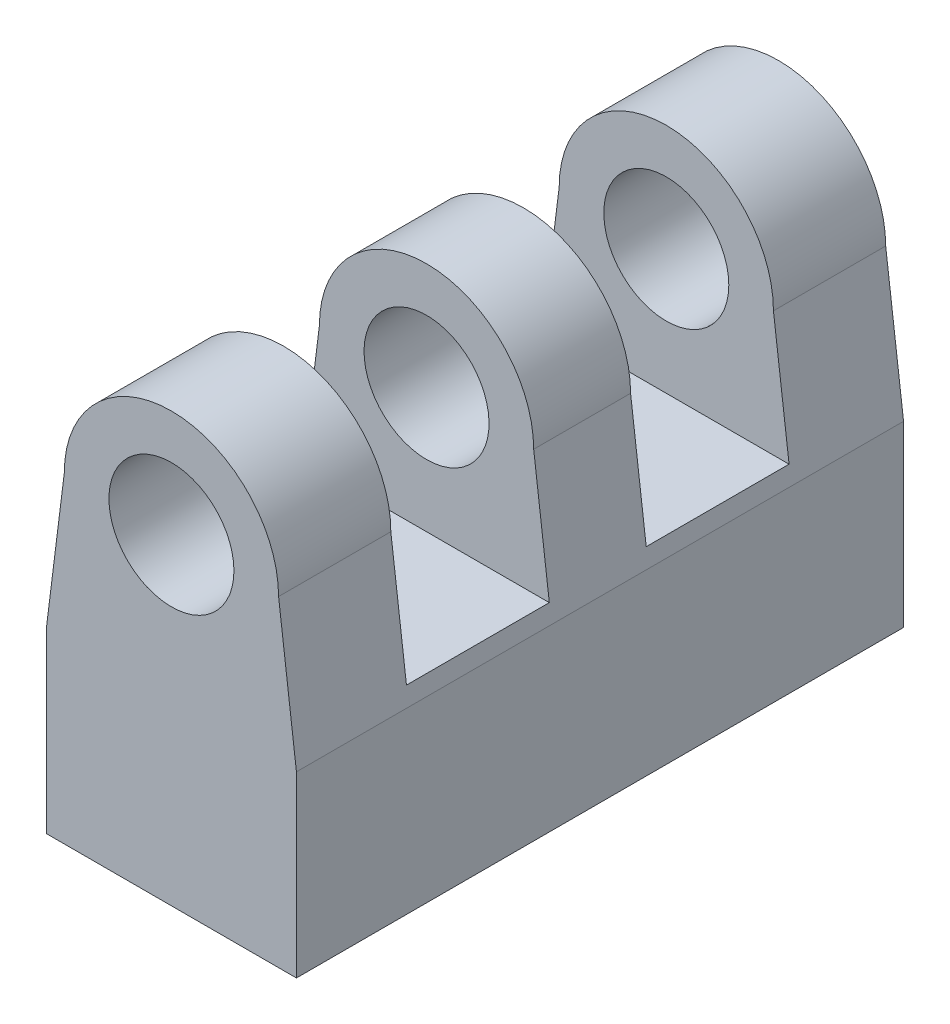
ISO-10303-21;
HEADER;
FILE_DESCRIPTION(('STEP AP214'),'2;1');
FILE_NAME('part.step','',(''),(''),'','','');
FILE_SCHEMA(('AUTOMOTIVE_DESIGN { 1 0 10303 214 1 1 1 1 }'));
ENDSEC;
DATA;
#1=APPLICATION_CONTEXT('core data for automotive mechanical design processes');
#2=APPLICATION_PROTOCOL_DEFINITION('international standard','automotive_design',2000,#1);
#3=PRODUCT_CONTEXT('',#1,'mechanical');
#4=PRODUCT('Part','Part','',(#3));
#5=PRODUCT_RELATED_PRODUCT_CATEGORY('part','',(#4));
#6=PRODUCT_DEFINITION_FORMATION('','',#4);
#7=PRODUCT_DEFINITION_CONTEXT('part definition',#1,'design');
#8=PRODUCT_DEFINITION('design','',#6,#7);
#9=PRODUCT_DEFINITION_SHAPE('','',#8);
#10=(LENGTH_UNIT() NAMED_UNIT(*) SI_UNIT(.MILLI.,.METRE.));
#11=(NAMED_UNIT(*) PLANE_ANGLE_UNIT() SI_UNIT($,.RADIAN.));
#12=(NAMED_UNIT(*) SI_UNIT($,.STERADIAN.) SOLID_ANGLE_UNIT());
#13=UNCERTAINTY_MEASURE_WITH_UNIT(LENGTH_MEASURE(1.E-05),#10,'distance_accuracy_value','');
#14=(GEOMETRIC_REPRESENTATION_CONTEXT(3) GLOBAL_UNCERTAINTY_ASSIGNED_CONTEXT((#13)) GLOBAL_UNIT_ASSIGNED_CONTEXT((#10,
#11,#12)) REPRESENTATION_CONTEXT('',''));
#15=CARTESIAN_POINT('',(0.,0.,0.));
#16=DIRECTION('',(0.,0.,1.));
#17=DIRECTION('',(1.,0.,0.));
#18=AXIS2_PLACEMENT_3D('',#15,#16,#17);
#19=CARTESIAN_POINT('',(6.,13.,34.));
#20=DIRECTION('',(-0.992277876713668,-0.124034734589208,0.));
#21=DIRECTION('',(0.124034734589208,-0.992277876713668,0.));
#22=AXIS2_PLACEMENT_3D('',#19,#20,#21);
#23=PLANE('',#22);
#24=DIRECTION('',(0.,0.,-1.));
#25=VECTOR('',#24,1.);
#26=CARTESIAN_POINT('',(6.875,6.,34.));
#27=LINE('',#26,#25);
#28=CARTESIAN_POINT('',(6.875,6.,27.7136266460323));
#29=VERTEX_POINT('',#28);
#30=CARTESIAN_POINT('',(6.875,6.,19.7136266460323));
#31=VERTEX_POINT('',#30);
#32=EDGE_CURVE('E165',#29,#31,#27,.T.);
#33=ORIENTED_EDGE('',*,*,#32,.F.);
#34=DIRECTION('',(-0.124034734589208,0.992277876713668,0.));
#35=VECTOR('',#34,1.);
#36=CARTESIAN_POINT('',(6.,13.,27.7136266460323));
#37=LINE('',#36,#35);
#38=CARTESIAN_POINT('',(6.,13.,27.7136266460323));
#39=VERTEX_POINT('',#38);
#40=EDGE_CURVE('E166',#29,#39,#37,.T.);
#41=ORIENTED_EDGE('',*,*,#40,.T.);
#42=DIRECTION('',(0.,0.,-1.));
#43=VECTOR('',#42,1.);
#44=CARTESIAN_POINT('',(6.,13.,34.));
#45=LINE('',#44,#43);
#46=CARTESIAN_POINT('',(6.,13.,34.));
#47=VERTEX_POINT('',#46);
#48=EDGE_CURVE('E235',#47,#39,#45,.T.);
#49=ORIENTED_EDGE('',*,*,#48,.F.);
#50=DIRECTION('',(-0.124034734589208,0.992277876713668,0.));
#51=VECTOR('',#50,1.);
#52=CARTESIAN_POINT('',(6.,13.,34.));
#53=LINE('',#52,#51);
#54=CARTESIAN_POINT('',(7.,5.,34.));
#55=VERTEX_POINT('',#54);
#56=EDGE_CURVE('E196',#55,#47,#53,.T.);
#57=ORIENTED_EDGE('',*,*,#56,.F.);
#58=DIRECTION('',(0.,0.,-1.));
#59=VECTOR('',#58,1.);
#60=CARTESIAN_POINT('',(7.,5.,34.));
#61=LINE('',#60,#59);
#62=CARTESIAN_POINT('',(7.,5.,0.));
#63=VERTEX_POINT('',#62);
#64=EDGE_CURVE('E239',#55,#63,#61,.T.);
#65=ORIENTED_EDGE('',*,*,#64,.T.);
#66=DIRECTION('',(-0.124034734589208,0.992277876713668,0.));
#67=VECTOR('',#66,1.);
#68=CARTESIAN_POINT('',(6.,13.,0.));
#69=LINE('',#68,#67);
#70=CARTESIAN_POINT('',(6.,13.,0.));
#71=VERTEX_POINT('',#70);
#72=EDGE_CURVE('E215',#63,#71,#69,.T.);
#73=ORIENTED_EDGE('',*,*,#72,.T.);
#74=CARTESIAN_POINT('',(6.,13.,6.28637335396769));
#75=VERTEX_POINT('',#74);
#76=EDGE_CURVE('E233',#75,#71,#45,.T.);
#77=ORIENTED_EDGE('',*,*,#76,.F.);
#78=DIRECTION('',(-0.124034734589208,0.992277876713668,0.));
#79=VECTOR('',#78,1.);
#80=CARTESIAN_POINT('',(6.,13.,6.28637335396769));
#81=LINE('',#80,#79);
#82=CARTESIAN_POINT('',(6.875,6.,6.28637335396769));
#83=VERTEX_POINT('',#82);
#84=EDGE_CURVE('E163',#83,#75,#81,.T.);
#85=ORIENTED_EDGE('',*,*,#84,.F.);
#86=DIRECTION('',(0.,0.,1.));
#87=VECTOR('',#86,1.);
#88=CARTESIAN_POINT('',(6.875,6.,34.));
#89=LINE('',#88,#87);
#90=CARTESIAN_POINT('',(6.875,6.,14.2863733539677));
#91=VERTEX_POINT('',#90);
#92=EDGE_CURVE('E152',#83,#91,#89,.T.);
#93=ORIENTED_EDGE('',*,*,#92,.T.);
#94=DIRECTION('',(-0.124034734589208,0.992277876713668,0.));
#95=VECTOR('',#94,1.);
#96=CARTESIAN_POINT('',(6.,13.,14.2863733539677));
#97=LINE('',#96,#95);
#98=CARTESIAN_POINT('',(6.,13.,14.2863733539677));
#99=VERTEX_POINT('',#98);
#100=EDGE_CURVE('E139',#91,#99,#97,.T.);
#101=ORIENTED_EDGE('',*,*,#100,.T.);
#102=CARTESIAN_POINT('',(6.,13.,19.7136266460323));
#103=VERTEX_POINT('',#102);
#104=EDGE_CURVE('E240',#103,#99,#45,.T.);
#105=ORIENTED_EDGE('',*,*,#104,.F.);
#106=DIRECTION('',(-0.124034734589208,0.992277876713668,0.));
#107=VECTOR('',#106,1.);
#108=CARTESIAN_POINT('',(6.,13.,19.7136266460323));
#109=LINE('',#108,#107);
#110=EDGE_CURVE('E271',#31,#103,#109,.T.);
#111=ORIENTED_EDGE('',*,*,#110,.F.);
#112=EDGE_LOOP('',(#33,#41,#49,#57,#65,#73,#77,#85,#93,#101,#105,#111));
#113=FACE_BOUND('',#112,.T.);
#114=ADVANCED_FACE('F39',(#113),#23,.F.);
#115=CARTESIAN_POINT('',(0.,13.,34.));
#116=DIRECTION('',(0.,0.,-1.));
#117=DIRECTION('',(-1.,0.,0.));
#118=AXIS2_PLACEMENT_3D('',#115,#116,#117);
#119=CYLINDRICAL_SURFACE('',#118,6.);
#120=DIRECTION('',(0.,0.,-1.));
#121=VECTOR('',#120,1.);
#122=CARTESIAN_POINT('',(-6.,13.,34.));
#123=LINE('',#122,#121);
#124=CARTESIAN_POINT('',(-6.,13.,19.7136266460323));
#125=VERTEX_POINT('',#124);
#126=CARTESIAN_POINT('',(-6.,13.,14.2863733539677));
#127=VERTEX_POINT('',#126);
#128=EDGE_CURVE('E234',#125,#127,#123,.T.);
#129=ORIENTED_EDGE('',*,*,#128,.F.);
#130=CARTESIAN_POINT('',(0.,13.,19.7136266460323));
#131=DIRECTION('',(0.,0.,1.));
#132=DIRECTION('',(0.,-1.,0.));
#133=AXIS2_PLACEMENT_3D('',#130,#131,#132);
#134=CIRCLE('',#133,6.);
#135=EDGE_CURVE('E63',#103,#125,#134,.T.);
#136=ORIENTED_EDGE('',*,*,#135,.F.);
#137=ORIENTED_EDGE('',*,*,#104,.T.);
#138=CARTESIAN_POINT('',(0.,13.,14.2863733539677));
#139=DIRECTION('',(0.,0.,1.));
#140=DIRECTION('',(0.,-1.,0.));
#141=AXIS2_PLACEMENT_3D('',#138,#139,#140);
#142=CIRCLE('',#141,6.);
#143=EDGE_CURVE('E141',#99,#127,#142,.T.);
#144=ORIENTED_EDGE('',*,*,#143,.T.);
#145=EDGE_LOOP('',(#129,#136,#137,#144));
#146=FACE_BOUND('',#145,.T.);
#147=ADVANCED_FACE('F346',(#146),#119,.T.);
#148=CARTESIAN_POINT('',(-6.,13.,6.28637335396769));
#149=VERTEX_POINT('',#148);
#150=CARTESIAN_POINT('',(-6.,13.,0.));
#151=VERTEX_POINT('',#150);
#152=EDGE_CURVE('E228',#149,#151,#123,.T.);
#153=ORIENTED_EDGE('',*,*,#152,.F.);
#154=CARTESIAN_POINT('',(0.,13.,6.28637335396769));
#155=DIRECTION('',(0.,0.,1.));
#156=DIRECTION('',(1.,0.,0.));
#157=AXIS2_PLACEMENT_3D('',#154,#155,#156);
#158=CIRCLE('',#157,6.);
#159=EDGE_CURVE('E287',#75,#149,#158,.T.);
#160=ORIENTED_EDGE('',*,*,#159,.F.);
#161=ORIENTED_EDGE('',*,*,#76,.T.);
#162=CARTESIAN_POINT('',(0.,13.,0.));
#163=DIRECTION('',(0.,0.,1.));
#164=DIRECTION('',(1.,0.,0.));
#165=AXIS2_PLACEMENT_3D('',#162,#163,#164);
#166=CIRCLE('',#165,6.);
#167=EDGE_CURVE('E219',#71,#151,#166,.T.);
#168=ORIENTED_EDGE('',*,*,#167,.T.);
#169=EDGE_LOOP('',(#153,#160,#161,#168));
#170=FACE_BOUND('',#169,.T.);
#171=ADVANCED_FACE('F340',(#170),#119,.T.);
#172=CARTESIAN_POINT('',(-6.,13.,34.));
#173=DIRECTION('',(0.992277876713668,-0.124034734589209,0.));
#174=DIRECTION('',(0.124034734589209,0.992277876713668,0.));
#175=AXIS2_PLACEMENT_3D('',#172,#173,#174);
#176=PLANE('',#175);
#177=CARTESIAN_POINT('',(-6.,13.,34.));
#178=VERTEX_POINT('',#177);
#179=CARTESIAN_POINT('',(-6.,13.,27.7136266460323));
#180=VERTEX_POINT('',#179);
#181=EDGE_CURVE('E229',#178,#180,#123,.T.);
#182=ORIENTED_EDGE('',*,*,#181,.T.);
#183=DIRECTION('',(-0.124034734589209,-0.992277876713668,0.));
#184=VECTOR('',#183,1.);
#185=CARTESIAN_POINT('',(-6.,13.,27.7136266460323));
#186=LINE('',#185,#184);
#187=CARTESIAN_POINT('',(-6.875,5.99999999999999,27.7136266460323));
#188=VERTEX_POINT('',#187);
#189=EDGE_CURVE('E270',#180,#188,#186,.T.);
#190=ORIENTED_EDGE('',*,*,#189,.T.);
#191=DIRECTION('',(0.,0.,1.));
#192=VECTOR('',#191,1.);
#193=CARTESIAN_POINT('',(-6.875,5.99999999999999,34.));
#194=LINE('',#193,#192);
#195=CARTESIAN_POINT('',(-6.875,5.99999999999999,19.7136266460323));
#196=VERTEX_POINT('',#195);
#197=EDGE_CURVE('E11',#196,#188,#194,.T.);
#198=ORIENTED_EDGE('',*,*,#197,.F.);
#199=DIRECTION('',(-0.124034734589209,-0.992277876713668,0.));
#200=VECTOR('',#199,1.);
#201=CARTESIAN_POINT('',(-6.,13.,19.7136266460323));
#202=LINE('',#201,#200);
#203=EDGE_CURVE('E266',#125,#196,#202,.T.);
#204=ORIENTED_EDGE('',*,*,#203,.F.);
#205=ORIENTED_EDGE('',*,*,#128,.T.);
#206=DIRECTION('',(-0.124034734589209,-0.992277876713668,0.));
#207=VECTOR('',#206,1.);
#208=CARTESIAN_POINT('',(-6.,13.,14.2863733539677));
#209=LINE('',#208,#207);
#210=CARTESIAN_POINT('',(-6.875,6.,14.2863733539677));
#211=VERTEX_POINT('',#210);
#212=EDGE_CURVE('E256',#127,#211,#209,.T.);
#213=ORIENTED_EDGE('',*,*,#212,.T.);
#214=DIRECTION('',(0.,0.,-1.));
#215=VECTOR('',#214,1.);
#216=CARTESIAN_POINT('',(-6.875,5.99999999999999,34.));
#217=LINE('',#216,#215);
#218=CARTESIAN_POINT('',(-6.875,5.99999999999999,6.28637335396769));
#219=VERTEX_POINT('',#218);
#220=EDGE_CURVE('E48',#211,#219,#217,.T.);
#221=ORIENTED_EDGE('',*,*,#220,.T.);
#222=DIRECTION('',(-0.124034734589209,-0.992277876713668,0.));
#223=VECTOR('',#222,1.);
#224=CARTESIAN_POINT('',(-6.,13.,6.28637335396769));
#225=LINE('',#224,#223);
#226=EDGE_CURVE('E261',#149,#219,#225,.T.);
#227=ORIENTED_EDGE('',*,*,#226,.F.);
#228=ORIENTED_EDGE('',*,*,#152,.T.);
#229=DIRECTION('',(-0.124034734589209,-0.992277876713668,0.));
#230=VECTOR('',#229,1.);
#231=CARTESIAN_POINT('',(-6.,13.,0.));
#232=LINE('',#231,#230);
#233=CARTESIAN_POINT('',(-7.,5.,0.));
#234=VERTEX_POINT('',#233);
#235=EDGE_CURVE('E190',#151,#234,#232,.T.);
#236=ORIENTED_EDGE('',*,*,#235,.T.);
#237=DIRECTION('',(0.,0.,-1.));
#238=VECTOR('',#237,1.);
#239=CARTESIAN_POINT('',(-7.,5.,34.));
#240=LINE('',#239,#238);
#241=CARTESIAN_POINT('',(-7.,5.,34.));
#242=VERTEX_POINT('',#241);
#243=EDGE_CURVE('E205',#242,#234,#240,.T.);
#244=ORIENTED_EDGE('',*,*,#243,.F.);
#245=DIRECTION('',(-0.124034734589209,-0.992277876713668,0.));
#246=VECTOR('',#245,1.);
#247=CARTESIAN_POINT('',(-6.,13.,34.));
#248=LINE('',#247,#246);
#249=EDGE_CURVE('E202',#178,#242,#248,.T.);
#250=ORIENTED_EDGE('',*,*,#249,.F.);
#251=EDGE_LOOP('',(#182,#190,#198,#204,#205,#213,#221,#227,#228,#236,#244,#250));
#252=FACE_BOUND('',#251,.T.);
#253=ADVANCED_FACE('F275',(#252),#176,.F.);
#254=CARTESIAN_POINT('',(0.,13.,34.));
#255=DIRECTION('',(0.,0.,-1.));
#256=DIRECTION('',(-1.,0.,0.));
#257=AXIS2_PLACEMENT_3D('',#254,#255,#256);
#258=CYLINDRICAL_SURFACE('',#257,3.5);
#259=CARTESIAN_POINT('',(0.,13.,0.));
#260=DIRECTION('',(0.,0.,1.));
#261=DIRECTION('',(1.,0.,0.));
#262=AXIS2_PLACEMENT_3D('',#259,#260,#261);
#263=CIRCLE('',#262,3.5);
#264=CARTESIAN_POINT('',(3.5,13.,0.));
#265=VERTEX_POINT('',#264);
#266=EDGE_CURVE('E170',#265,#265,#263,.T.);
#267=ORIENTED_EDGE('',*,*,#266,.F.);
#268=EDGE_LOOP('',(#267));
#269=FACE_BOUND('',#268,.T.);
#270=CARTESIAN_POINT('',(0.,13.,6.28637335396769));
#271=DIRECTION('',(0.,0.,1.));
#272=DIRECTION('',(1.,0.,0.));
#273=AXIS2_PLACEMENT_3D('',#270,#271,#272);
#274=CIRCLE('',#273,3.5);
#275=CARTESIAN_POINT('',(3.5,13.,6.28637335396769));
#276=VERTEX_POINT('',#275);
#277=EDGE_CURVE('E147',#276,#276,#274,.T.);
#278=ORIENTED_EDGE('',*,*,#277,.T.);
#279=EDGE_LOOP('',(#278));
#280=FACE_BOUND('',#279,.T.);
#281=ADVANCED_FACE('F379',(#269,#280),#258,.F.);
#282=CARTESIAN_POINT('',(0.,13.,34.));
#283=DIRECTION('',(0.,0.,1.));
#284=DIRECTION('',(1.,0.,0.));
#285=AXIS2_PLACEMENT_3D('',#282,#283,#284);
#286=PLANE('',#285);
#287=DIRECTION('',(0.,-1.,0.));
#288=VECTOR('',#287,1.);
#289=CARTESIAN_POINT('',(-7.,5.,34.));
#290=LINE('',#289,#288);
#291=CARTESIAN_POINT('',(-7.,-5.,34.));
#292=VERTEX_POINT('',#291);
#293=EDGE_CURVE('E185',#242,#292,#290,.T.);
#294=ORIENTED_EDGE('',*,*,#293,.T.);
#295=DIRECTION('',(1.,0.,0.));
#296=VECTOR('',#295,1.);
#297=CARTESIAN_POINT('',(7.,-5.,34.));
#298=LINE('',#297,#296);
#299=CARTESIAN_POINT('',(7.,-5.,34.));
#300=VERTEX_POINT('',#299);
#301=EDGE_CURVE('E189',#292,#300,#298,.T.);
#302=ORIENTED_EDGE('',*,*,#301,.T.);
#303=DIRECTION('',(0.,1.,0.));
#304=VECTOR('',#303,1.);
#305=CARTESIAN_POINT('',(7.,5.,34.));
#306=LINE('',#305,#304);
#307=EDGE_CURVE('E193',#300,#55,#306,.T.);
#308=ORIENTED_EDGE('',*,*,#307,.T.);
#309=ORIENTED_EDGE('',*,*,#56,.T.);
#310=CARTESIAN_POINT('',(0.,13.,34.));
#311=DIRECTION('',(0.,0.,1.));
#312=DIRECTION('',(1.,0.,0.));
#313=AXIS2_PLACEMENT_3D('',#310,#311,#312);
#314=CIRCLE('',#313,6.);
#315=EDGE_CURVE('E199',#47,#178,#314,.T.);
#316=ORIENTED_EDGE('',*,*,#315,.T.);
#317=ORIENTED_EDGE('',*,*,#249,.T.);
#318=EDGE_LOOP('',(#294,#302,#308,#309,#316,#317));
#319=FACE_BOUND('',#318,.T.);
#320=CARTESIAN_POINT('',(0.,13.,34.));
#321=DIRECTION('',(0.,0.,1.));
#322=DIRECTION('',(1.,0.,0.));
#323=AXIS2_PLACEMENT_3D('',#320,#321,#322);
#324=CIRCLE('',#323,3.5);
#325=CARTESIAN_POINT('',(3.5,13.,34.));
#326=VERTEX_POINT('',#325);
#327=EDGE_CURVE('E177',#326,#326,#324,.T.);
#328=ORIENTED_EDGE('',*,*,#327,.F.);
#329=EDGE_LOOP('',(#328));
#330=FACE_BOUND('',#329,.T.);
#331=ADVANCED_FACE('F316',(#319,#330),#286,.T.);
#332=CARTESIAN_POINT('',(0.,13.,0.));
#333=DIRECTION('',(0.,0.,1.));
#334=DIRECTION('',(1.,0.,0.));
#335=AXIS2_PLACEMENT_3D('',#332,#333,#334);
#336=PLANE('',#335);
#337=DIRECTION('',(0.,-1.,0.));
#338=VECTOR('',#337,1.);
#339=CARTESIAN_POINT('',(-7.,5.,0.));
#340=LINE('',#339,#338);
#341=CARTESIAN_POINT('',(-7.,-5.,0.));
#342=VERTEX_POINT('',#341);
#343=EDGE_CURVE('E181',#234,#342,#340,.T.);
#344=ORIENTED_EDGE('',*,*,#343,.F.);
#345=ORIENTED_EDGE('',*,*,#235,.F.);
#346=ORIENTED_EDGE('',*,*,#167,.F.);
#347=ORIENTED_EDGE('',*,*,#72,.F.);
#348=DIRECTION('',(0.,1.,0.));
#349=VECTOR('',#348,1.);
#350=CARTESIAN_POINT('',(7.,5.,0.));
#351=LINE('',#350,#349);
#352=CARTESIAN_POINT('',(7.,-5.,0.));
#353=VERTEX_POINT('',#352);
#354=EDGE_CURVE('E212',#353,#63,#351,.T.);
#355=ORIENTED_EDGE('',*,*,#354,.F.);
#356=DIRECTION('',(1.,0.,0.));
#357=VECTOR('',#356,1.);
#358=CARTESIAN_POINT('',(7.,-5.,0.));
#359=LINE('',#358,#357);
#360=EDGE_CURVE('E209',#342,#353,#359,.T.);
#361=ORIENTED_EDGE('',*,*,#360,.F.);
#362=EDGE_LOOP('',(#344,#345,#346,#347,#355,#361));
#363=FACE_BOUND('',#362,.T.);
#364=ORIENTED_EDGE('',*,*,#266,.T.);
#365=EDGE_LOOP('',(#364));
#366=FACE_BOUND('',#365,.T.);
#367=ADVANCED_FACE('F353',(#363,#366),#336,.F.);
#368=CARTESIAN_POINT('',(-7.,5.,34.));
#369=DIRECTION('',(1.,0.,0.));
#370=DIRECTION('',(0.,1.,0.));
#371=AXIS2_PLACEMENT_3D('',#368,#369,#370);
#372=PLANE('',#371);
#373=ORIENTED_EDGE('',*,*,#343,.T.);
#374=DIRECTION('',(0.,0.,-1.));
#375=VECTOR('',#374,1.);
#376=CARTESIAN_POINT('',(-7.,-5.,34.));
#377=LINE('',#376,#375);
#378=EDGE_CURVE('E248',#292,#342,#377,.T.);
#379=ORIENTED_EDGE('',*,*,#378,.F.);
#380=ORIENTED_EDGE('',*,*,#293,.F.);
#381=ORIENTED_EDGE('',*,*,#243,.T.);
#382=EDGE_LOOP('',(#373,#379,#380,#381));
#383=FACE_BOUND('',#382,.T.);
#384=ADVANCED_FACE('F41',(#383),#372,.F.);
#385=CARTESIAN_POINT('',(7.,-5.,34.));
#386=DIRECTION('',(0.,1.,0.));
#387=DIRECTION('',(-1.,0.,0.));
#388=AXIS2_PLACEMENT_3D('',#385,#386,#387);
#389=PLANE('',#388);
#390=CARTESIAN_POINT('',(-0.00187345435231069,-5.,27.));
#391=DIRECTION('',(0.,-1.,0.));
#392=DIRECTION('',(1.,0.,0.));
#393=AXIS2_PLACEMENT_3D('',#390,#391,#392);
#394=CIRCLE('',#393,5.05);
#395=CARTESIAN_POINT('',(5.04812654564769,-5.,27.));
#396=VERTEX_POINT('',#395);
#397=EDGE_CURVE('E424',#396,#396,#394,.T.);
#398=ORIENTED_EDGE('',*,*,#397,.F.);
#399=EDGE_LOOP('',(#398));
#400=FACE_BOUND('',#399,.T.);
#401=CARTESIAN_POINT('',(-0.00187345435231069,-5.,7.));
#402=DIRECTION('',(0.,-1.,0.));
#403=DIRECTION('',(1.,0.,0.));
#404=AXIS2_PLACEMENT_3D('',#401,#402,#403);
#405=CIRCLE('',#404,5.05);
#406=CARTESIAN_POINT('',(5.04812654564769,-5.,7.));
#407=VERTEX_POINT('',#406);
#408=EDGE_CURVE('E428',#407,#407,#405,.T.);
#409=ORIENTED_EDGE('',*,*,#408,.F.);
#410=EDGE_LOOP('',(#409));
#411=FACE_BOUND('',#410,.T.);
#412=ORIENTED_EDGE('',*,*,#360,.T.);
#413=DIRECTION('',(0.,0.,-1.));
#414=VECTOR('',#413,1.);
#415=CARTESIAN_POINT('',(7.,-5.,34.));
#416=LINE('',#415,#414);
#417=EDGE_CURVE('E244',#300,#353,#416,.T.);
#418=ORIENTED_EDGE('',*,*,#417,.F.);
#419=ORIENTED_EDGE('',*,*,#301,.F.);
#420=ORIENTED_EDGE('',*,*,#378,.T.);
#421=EDGE_LOOP('',(#412,#418,#419,#420));
#422=FACE_BOUND('',#421,.T.);
#423=ADVANCED_FACE('F358',(#400,#411,#422),#389,.F.);
#424=CARTESIAN_POINT('',(7.,5.,34.));
#425=DIRECTION('',(-1.,0.,0.));
#426=DIRECTION('',(0.,-1.,0.));
#427=AXIS2_PLACEMENT_3D('',#424,#425,#426);
#428=PLANE('',#427);
#429=ORIENTED_EDGE('',*,*,#354,.T.);
#430=ORIENTED_EDGE('',*,*,#64,.F.);
#431=ORIENTED_EDGE('',*,*,#307,.F.);
#432=ORIENTED_EDGE('',*,*,#417,.T.);
#433=EDGE_LOOP('',(#429,#430,#431,#432));
#434=FACE_BOUND('',#433,.T.);
#435=ADVANCED_FACE('F361',(#434),#428,.F.);
#436=CARTESIAN_POINT('',(0.,13.,27.7136266460323));
#437=DIRECTION('',(0.,0.,1.));
#438=DIRECTION('',(1.,0.,0.));
#439=AXIS2_PLACEMENT_3D('',#436,#437,#438);
#440=CIRCLE('',#439,6.);
#441=EDGE_CURVE('E173',#39,#180,#440,.T.);
#442=ORIENTED_EDGE('',*,*,#441,.T.);
#443=ORIENTED_EDGE('',*,*,#181,.F.);
#444=ORIENTED_EDGE('',*,*,#315,.F.);
#445=ORIENTED_EDGE('',*,*,#48,.T.);
#446=EDGE_LOOP('',(#442,#443,#444,#445));
#447=FACE_BOUND('',#446,.T.);
#448=ADVANCED_FACE('F304',(#447),#119,.T.);
#449=CARTESIAN_POINT('',(0.,13.,27.7136266460323));
#450=DIRECTION('',(0.,0.,1.));
#451=DIRECTION('',(1.,0.,0.));
#452=AXIS2_PLACEMENT_3D('',#449,#450,#451);
#453=CIRCLE('',#452,3.5);
#454=CARTESIAN_POINT('',(3.5,13.,27.7136266460323));
#455=VERTEX_POINT('',#454);
#456=EDGE_CURVE('E267',#455,#455,#453,.T.);
#457=ORIENTED_EDGE('',*,*,#456,.F.);
#458=EDGE_LOOP('',(#457));
#459=FACE_BOUND('',#458,.T.);
#460=ORIENTED_EDGE('',*,*,#327,.T.);
#461=EDGE_LOOP('',(#460));
#462=FACE_BOUND('',#461,.T.);
#463=ADVANCED_FACE('F368',(#459,#462),#258,.F.);
#464=CARTESIAN_POINT('',(-7.,5.99999999999999,0.));
#465=DIRECTION('',(0.,-1.,0.));
#466=DIRECTION('',(1.,0.,0.));
#467=AXIS2_PLACEMENT_3D('',#464,#465,#466);
#468=PLANE('',#467);
#469=DIRECTION('',(1.,0.,0.));
#470=VECTOR('',#469,1.);
#471=CARTESIAN_POINT('',(-7.,5.99999999999999,6.28637335396769));
#472=LINE('',#471,#470);
#473=EDGE_CURVE('E157',#219,#83,#472,.T.);
#474=ORIENTED_EDGE('',*,*,#473,.F.);
#475=ORIENTED_EDGE('',*,*,#220,.F.);
#476=DIRECTION('',(1.,0.,0.));
#477=VECTOR('',#476,1.);
#478=CARTESIAN_POINT('',(-7.,5.99999999999999,14.2863733539677));
#479=LINE('',#478,#477);
#480=EDGE_CURVE('E55',#211,#91,#479,.T.);
#481=ORIENTED_EDGE('',*,*,#480,.T.);
#482=ORIENTED_EDGE('',*,*,#92,.F.);
#483=EDGE_LOOP('',(#474,#475,#481,#482));
#484=FACE_BOUND('',#483,.T.);
#485=ADVANCED_FACE('F151',(#484),#468,.F.);
#486=CARTESIAN_POINT('',(-7.,0.,6.28637335396769));
#487=DIRECTION('',(0.,0.,1.));
#488=DIRECTION('',(1.,0.,0.));
#489=AXIS2_PLACEMENT_3D('',#486,#487,#488);
#490=PLANE('',#489);
#491=ORIENTED_EDGE('',*,*,#277,.F.);
#492=EDGE_LOOP('',(#491));
#493=FACE_BOUND('',#492,.T.);
#494=ORIENTED_EDGE('',*,*,#84,.T.);
#495=ORIENTED_EDGE('',*,*,#159,.T.);
#496=ORIENTED_EDGE('',*,*,#226,.T.);
#497=ORIENTED_EDGE('',*,*,#473,.T.);
#498=EDGE_LOOP('',(#494,#495,#496,#497));
#499=FACE_BOUND('',#498,.T.);
#500=ADVANCED_FACE('F337',(#493,#499),#490,.T.);
#501=CARTESIAN_POINT('',(-7.,0.,14.2863733539677));
#502=DIRECTION('',(0.,0.,1.));
#503=DIRECTION('',(0.,-1.,0.));
#504=AXIS2_PLACEMENT_3D('',#501,#502,#503);
#505=PLANE('',#504);
#506=CARTESIAN_POINT('',(0.,13.,14.2863733539677));
#507=DIRECTION('',(0.,0.,1.));
#508=DIRECTION('',(0.,-1.,0.));
#509=AXIS2_PLACEMENT_3D('',#506,#507,#508);
#510=CIRCLE('',#509,3.5);
#511=CARTESIAN_POINT('',(0.,9.5,14.2863733539677));
#512=VERTEX_POINT('',#511);
#513=EDGE_CURVE('E252',#512,#512,#510,.T.);
#514=ORIENTED_EDGE('',*,*,#513,.T.);
#515=EDGE_LOOP('',(#514));
#516=FACE_BOUND('',#515,.T.);
#517=ORIENTED_EDGE('',*,*,#480,.F.);
#518=ORIENTED_EDGE('',*,*,#212,.F.);
#519=ORIENTED_EDGE('',*,*,#143,.F.);
#520=ORIENTED_EDGE('',*,*,#100,.F.);
#521=EDGE_LOOP('',(#517,#518,#519,#520));
#522=FACE_BOUND('',#521,.T.);
#523=ADVANCED_FACE('F140',(#516,#522),#505,.F.);
#524=CARTESIAN_POINT('',(-7.,5.99999999999999,0.));
#525=DIRECTION('',(0.,1.,0.));
#526=DIRECTION('',(-1.,0.,0.));
#527=AXIS2_PLACEMENT_3D('',#524,#525,#526);
#528=PLANE('',#527);
#529=ORIENTED_EDGE('',*,*,#32,.T.);
#530=DIRECTION('',(1.,0.,0.));
#531=VECTOR('',#530,1.);
#532=CARTESIAN_POINT('',(-7.,5.99999999999999,19.7136266460323));
#533=LINE('',#532,#531);
#534=EDGE_CURVE('E328',#196,#31,#533,.T.);
#535=ORIENTED_EDGE('',*,*,#534,.F.);
#536=ORIENTED_EDGE('',*,*,#197,.T.);
#537=DIRECTION('',(1.,0.,0.));
#538=VECTOR('',#537,1.);
#539=CARTESIAN_POINT('',(-7.,5.99999999999999,27.7136266460323));
#540=LINE('',#539,#538);
#541=EDGE_CURVE('E257',#188,#29,#540,.T.);
#542=ORIENTED_EDGE('',*,*,#541,.T.);
#543=EDGE_LOOP('',(#529,#535,#536,#542));
#544=FACE_BOUND('',#543,.T.);
#545=ADVANCED_FACE('F324',(#544),#528,.T.);
#546=CARTESIAN_POINT('',(-7.,0.,27.7136266460323));
#547=DIRECTION('',(0.,0.,1.));
#548=DIRECTION('',(1.,0.,0.));
#549=AXIS2_PLACEMENT_3D('',#546,#547,#548);
#550=PLANE('',#549);
#551=ORIENTED_EDGE('',*,*,#456,.T.);
#552=EDGE_LOOP('',(#551));
#553=FACE_BOUND('',#552,.T.);
#554=ORIENTED_EDGE('',*,*,#541,.F.);
#555=ORIENTED_EDGE('',*,*,#189,.F.);
#556=ORIENTED_EDGE('',*,*,#441,.F.);
#557=ORIENTED_EDGE('',*,*,#40,.F.);
#558=EDGE_LOOP('',(#554,#555,#556,#557));
#559=FACE_BOUND('',#558,.T.);
#560=ADVANCED_FACE('F310',(#553,#559),#550,.F.);
#561=CARTESIAN_POINT('',(-7.,0.,19.7136266460323));
#562=DIRECTION('',(0.,0.,1.));
#563=DIRECTION('',(0.,-1.,0.));
#564=AXIS2_PLACEMENT_3D('',#561,#562,#563);
#565=PLANE('',#564);
#566=CARTESIAN_POINT('',(0.,13.,19.7136266460323));
#567=DIRECTION('',(0.,0.,1.));
#568=DIRECTION('',(0.,-1.,0.));
#569=AXIS2_PLACEMENT_3D('',#566,#567,#568);
#570=CIRCLE('',#569,3.5);
#571=CARTESIAN_POINT('',(0.,9.5,19.7136266460323));
#572=VERTEX_POINT('',#571);
#573=EDGE_CURVE('E262',#572,#572,#570,.T.);
#574=ORIENTED_EDGE('',*,*,#573,.F.);
#575=EDGE_LOOP('',(#574));
#576=FACE_BOUND('',#575,.T.);
#577=ORIENTED_EDGE('',*,*,#110,.T.);
#578=ORIENTED_EDGE('',*,*,#135,.T.);
#579=ORIENTED_EDGE('',*,*,#203,.T.);
#580=ORIENTED_EDGE('',*,*,#534,.T.);
#581=EDGE_LOOP('',(#577,#578,#579,#580));
#582=FACE_BOUND('',#581,.T.);
#583=ADVANCED_FACE('F347',(#576,#582),#565,.T.);
#584=ORIENTED_EDGE('',*,*,#513,.F.);
#585=EDGE_LOOP('',(#584));
#586=FACE_BOUND('',#585,.T.);
#587=ORIENTED_EDGE('',*,*,#573,.T.);
#588=EDGE_LOOP('',(#587));
#589=FACE_BOUND('',#588,.T.);
#590=ADVANCED_FACE('F387',(#586,#589),#258,.F.);
#591=CARTESIAN_POINT('',(-0.00187345435231193,5.,7.));
#592=DIRECTION('',(0.,-1.,0.));
#593=DIRECTION('',(1.,0.,0.));
#594=AXIS2_PLACEMENT_3D('',#591,#592,#593);
#595=CYLINDRICAL_SURFACE('',#594,5.05);
#596=CARTESIAN_POINT('',(-0.00187345435231193,5.,7.));
#597=DIRECTION('',(0.,-1.,0.));
#598=DIRECTION('',(1.,0.,0.));
#599=AXIS2_PLACEMENT_3D('',#596,#597,#598);
#600=CIRCLE('',#599,5.05);
#601=CARTESIAN_POINT('',(5.04812654564769,5.,7.));
#602=VERTEX_POINT('',#601);
#603=EDGE_CURVE('E333',#602,#602,#600,.T.);
#604=ORIENTED_EDGE('',*,*,#603,.F.);
#605=EDGE_LOOP('',(#604));
#606=FACE_BOUND('',#605,.T.);
#607=ORIENTED_EDGE('',*,*,#408,.T.);
#608=EDGE_LOOP('',(#607));
#609=FACE_BOUND('',#608,.T.);
#610=ADVANCED_FACE('F408',(#606,#609),#595,.F.);
#611=CARTESIAN_POINT('',(-0.00187345435231193,5.,7.));
#612=DIRECTION('',(0.,-1.,0.));
#613=DIRECTION('',(1.,0.,0.));
#614=AXIS2_PLACEMENT_3D('',#611,#612,#613);
#615=PLANE('',#614);
#616=ORIENTED_EDGE('',*,*,#603,.T.);
#617=EDGE_LOOP('',(#616));
#618=FACE_BOUND('',#617,.T.);
#619=ADVANCED_FACE('F404',(#618),#615,.T.);
#620=CARTESIAN_POINT('',(-0.00187345435231193,5.,27.));
#621=DIRECTION('',(0.,-1.,0.));
#622=DIRECTION('',(1.,0.,0.));
#623=AXIS2_PLACEMENT_3D('',#620,#621,#622);
#624=CYLINDRICAL_SURFACE('',#623,5.05);
#625=CARTESIAN_POINT('',(-0.00187345435231193,5.,27.));
#626=DIRECTION('',(0.,-1.,0.));
#627=DIRECTION('',(1.,0.,0.));
#628=AXIS2_PLACEMENT_3D('',#625,#626,#627);
#629=CIRCLE('',#628,5.05);
#630=CARTESIAN_POINT('',(5.04812654564769,5.,27.));
#631=VERTEX_POINT('',#630);
#632=EDGE_CURVE('E158',#631,#631,#629,.T.);
#633=ORIENTED_EDGE('',*,*,#632,.F.);
#634=EDGE_LOOP('',(#633));
#635=FACE_BOUND('',#634,.T.);
#636=ORIENTED_EDGE('',*,*,#397,.T.);
#637=EDGE_LOOP('',(#636));
#638=FACE_BOUND('',#637,.T.);
#639=ADVANCED_FACE('F407',(#635,#638),#624,.F.);
#640=CARTESIAN_POINT('',(-0.00187345435231193,5.,27.));
#641=DIRECTION('',(0.,-1.,0.));
#642=DIRECTION('',(1.,0.,0.));
#643=AXIS2_PLACEMENT_3D('',#640,#641,#642);
#644=PLANE('',#643);
#645=ORIENTED_EDGE('',*,*,#632,.T.);
#646=EDGE_LOOP('',(#645));
#647=FACE_BOUND('',#646,.T.);
#648=ADVANCED_FACE('F415',(#647),#644,.T.);
#649=CLOSED_SHELL('',(#114,#147,#171,#253,#281,#331,#367,#384,#423,#435,#448,#463,#485,#500,
#523,#545,#560,#583,#590,#610,#619,#639,#648));
#650=MANIFOLD_SOLID_BREP('B2',#649);
#651=ADVANCED_BREP_SHAPE_REPRESENTATION('',(#18,#650),#14);
#652=SHAPE_DEFINITION_REPRESENTATION(#9,#651);
ENDSEC;
END-ISO-10303-21;
